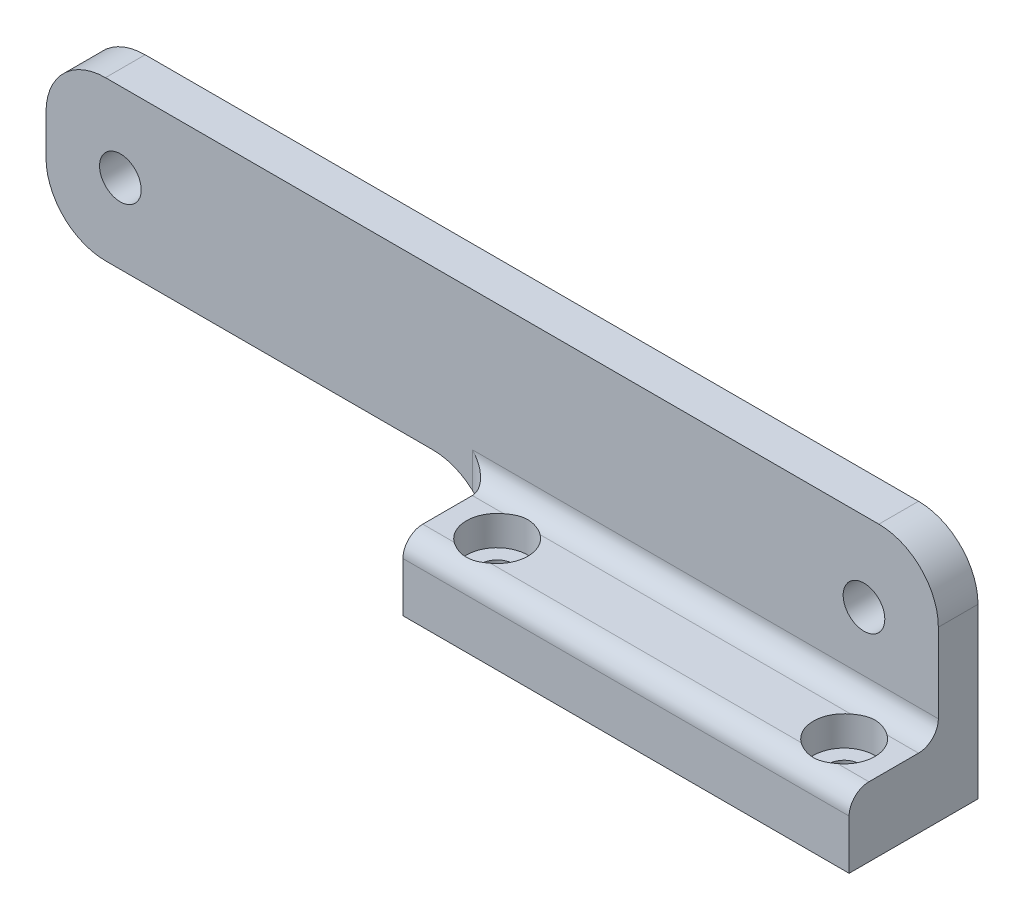
ISO-10303-21;
HEADER;
FILE_DESCRIPTION(('STEP AP214'),'2;1');
FILE_NAME('part.step','',(''),(''),'','','');
FILE_SCHEMA(('AUTOMOTIVE_DESIGN { 1 0 10303 214 1 1 1 1 }'));
ENDSEC;
DATA;
#1=APPLICATION_CONTEXT('core data for automotive mechanical design processes');
#2=APPLICATION_PROTOCOL_DEFINITION('international standard','automotive_design',2000,#1);
#3=PRODUCT_CONTEXT('',#1,'mechanical');
#4=PRODUCT('Part','Part','',(#3));
#5=PRODUCT_RELATED_PRODUCT_CATEGORY('part','',(#4));
#6=PRODUCT_DEFINITION_FORMATION('','',#4);
#7=PRODUCT_DEFINITION_CONTEXT('part definition',#1,'design');
#8=PRODUCT_DEFINITION('design','',#6,#7);
#9=PRODUCT_DEFINITION_SHAPE('','',#8);
#10=(LENGTH_UNIT() NAMED_UNIT(*) SI_UNIT(.MILLI.,.METRE.));
#11=(NAMED_UNIT(*) PLANE_ANGLE_UNIT() SI_UNIT($,.RADIAN.));
#12=(NAMED_UNIT(*) SI_UNIT($,.STERADIAN.) SOLID_ANGLE_UNIT());
#13=UNCERTAINTY_MEASURE_WITH_UNIT(LENGTH_MEASURE(1.E-05),#10,'distance_accuracy_value','');
#14=(GEOMETRIC_REPRESENTATION_CONTEXT(3) GLOBAL_UNCERTAINTY_ASSIGNED_CONTEXT((#13)) GLOBAL_UNIT_ASSIGNED_CONTEXT((#10,
#11,#12)) REPRESENTATION_CONTEXT('',''));
#15=CARTESIAN_POINT('',(0.,0.,0.));
#16=DIRECTION('',(0.,0.,1.));
#17=DIRECTION('',(1.,0.,0.));
#18=AXIS2_PLACEMENT_3D('',#15,#16,#17);
#19=CARTESIAN_POINT('',(0.,-8.,0.));
#20=DIRECTION('',(0.,1.,0.));
#21=DIRECTION('',(-1.,0.,0.));
#22=AXIS2_PLACEMENT_3D('',#19,#20,#21);
#23=PLANE('',#22);
#24=DIRECTION('',(0.,0.,-1.));
#25=VECTOR('',#24,1.);
#26=CARTESIAN_POINT('',(0.,-8.,0.));
#27=LINE('',#26,#25);
#28=CARTESIAN_POINT('',(0.,-8.,11.));
#29=VERTEX_POINT('',#28);
#30=CARTESIAN_POINT('',(0.,-8.,6.));
#31=VERTEX_POINT('',#30);
#32=EDGE_CURVE('E339',#29,#31,#27,.T.);
#33=ORIENTED_EDGE('',*,*,#32,.F.);
#34=DIRECTION('',(-1.,0.,0.));
#35=VECTOR('',#34,1.);
#36=CARTESIAN_POINT('',(45.,-7.99999999999999,11.));
#37=LINE('',#36,#35);
#38=CARTESIAN_POINT('',(3.16696972201766,-8.,11.));
#39=VERTEX_POINT('',#38);
#40=EDGE_CURVE('E306',#29,#39,#37,.F.);
#41=ORIENTED_EDGE('',*,*,#40,.T.);
#42=CARTESIAN_POINT('',(5.,-8.,8.5));
#43=DIRECTION('',(0.,1.,0.));
#44=DIRECTION('',(-1.,0.,0.));
#45=AXIS2_PLACEMENT_3D('',#42,#43,#44);
#46=CIRCLE('',#45,3.1);
#47=CARTESIAN_POINT('',(3.16696972201766,-8.,6.));
#48=VERTEX_POINT('',#47);
#49=EDGE_CURVE('E355',#39,#48,#46,.F.);
#50=ORIENTED_EDGE('',*,*,#49,.T.);
#51=DIRECTION('',(1.,0.,0.));
#52=VECTOR('',#51,1.);
#53=CARTESIAN_POINT('',(0.,-8.,6.));
#54=LINE('',#53,#52);
#55=EDGE_CURVE('E189',#48,#31,#54,.F.);
#56=ORIENTED_EDGE('',*,*,#55,.T.);
#57=EDGE_LOOP('',(#33,#41,#50,#56));
#58=FACE_BOUND('',#57,.T.);
#59=ADVANCED_FACE('F39',(#58),#23,.T.);
#60=CARTESIAN_POINT('',(6.83303027798234,-8.,6.));
#61=VERTEX_POINT('',#60);
#62=CARTESIAN_POINT('',(6.83303027798234,-8.,11.));
#63=VERTEX_POINT('',#62);
#64=EDGE_CURVE('E325',#61,#63,#46,.F.);
#65=ORIENTED_EDGE('',*,*,#64,.T.);
#66=DIRECTION('',(-1.,0.,0.));
#67=VECTOR('',#66,1.);
#68=CARTESIAN_POINT('',(45.,-7.99999999999999,11.));
#69=LINE('',#68,#67);
#70=CARTESIAN_POINT('',(38.1669697220176,-7.99999999999999,11.));
#71=VERTEX_POINT('',#70);
#72=EDGE_CURVE('E54',#63,#71,#69,.F.);
#73=ORIENTED_EDGE('',*,*,#72,.T.);
#74=CARTESIAN_POINT('',(40.,-7.99999999999999,8.5));
#75=DIRECTION('',(0.,1.,0.));
#76=DIRECTION('',(-1.,0.,0.));
#77=AXIS2_PLACEMENT_3D('',#74,#75,#76);
#78=CIRCLE('',#77,3.1);
#79=CARTESIAN_POINT('',(38.1669697220176,-7.99999999999999,6.));
#80=VERTEX_POINT('',#79);
#81=EDGE_CURVE('E164',#71,#80,#78,.F.);
#82=ORIENTED_EDGE('',*,*,#81,.T.);
#83=EDGE_CURVE('E169',#80,#61,#54,.F.);
#84=ORIENTED_EDGE('',*,*,#83,.T.);
#85=EDGE_LOOP('',(#65,#73,#82,#84));
#86=FACE_BOUND('',#85,.T.);
#87=ADVANCED_FACE('F170',(#86),#23,.T.);
#88=CARTESIAN_POINT('',(40.,-15.,8.5));
#89=DIRECTION('',(0.,1.,0.));
#90=DIRECTION('',(-1.,0.,0.));
#91=AXIS2_PLACEMENT_3D('',#88,#89,#90);
#92=CYLINDRICAL_SURFACE('',#91,1.6);
#93=CARTESIAN_POINT('',(40.,-15.,8.5));
#94=DIRECTION('',(0.,-1.,0.));
#95=DIRECTION('',(1.,0.,0.));
#96=AXIS2_PLACEMENT_3D('',#93,#94,#95);
#97=CIRCLE('',#96,1.6);
#98=CARTESIAN_POINT('',(41.6,-15.,8.5));
#99=VERTEX_POINT('',#98);
#100=EDGE_CURVE('E343',#99,#99,#97,.T.);
#101=ORIENTED_EDGE('',*,*,#100,.T.);
#102=EDGE_LOOP('',(#101));
#103=FACE_BOUND('',#102,.T.);
#104=CARTESIAN_POINT('',(40.,-11.,8.5));
#105=DIRECTION('',(0.,1.,0.));
#106=DIRECTION('',(-1.,0.,0.));
#107=AXIS2_PLACEMENT_3D('',#104,#105,#106);
#108=CIRCLE('',#107,1.6);
#109=CARTESIAN_POINT('',(38.4,-11.,8.5));
#110=VERTEX_POINT('',#109);
#111=EDGE_CURVE('E317',#110,#110,#108,.T.);
#112=ORIENTED_EDGE('',*,*,#111,.T.);
#113=EDGE_LOOP('',(#112));
#114=FACE_BOUND('',#113,.T.);
#115=ADVANCED_FACE('F272',(#103,#114),#92,.F.);
#116=CARTESIAN_POINT('',(5.,-15.,8.5));
#117=DIRECTION('',(0.,1.,0.));
#118=DIRECTION('',(-1.,0.,0.));
#119=AXIS2_PLACEMENT_3D('',#116,#117,#118);
#120=CYLINDRICAL_SURFACE('',#119,1.6);
#121=CARTESIAN_POINT('',(5.,-15.,8.5));
#122=DIRECTION('',(0.,-1.,0.));
#123=DIRECTION('',(1.,0.,0.));
#124=AXIS2_PLACEMENT_3D('',#121,#122,#123);
#125=CIRCLE('',#124,1.6);
#126=CARTESIAN_POINT('',(6.6,-15.,8.5));
#127=VERTEX_POINT('',#126);
#128=EDGE_CURVE('E358',#127,#127,#125,.T.);
#129=ORIENTED_EDGE('',*,*,#128,.T.);
#130=EDGE_LOOP('',(#129));
#131=FACE_BOUND('',#130,.T.);
#132=CARTESIAN_POINT('',(5.,-11.,8.5));
#133=DIRECTION('',(0.,1.,0.));
#134=DIRECTION('',(-1.,0.,0.));
#135=AXIS2_PLACEMENT_3D('',#132,#133,#134);
#136=CIRCLE('',#135,1.6);
#137=CARTESIAN_POINT('',(3.4,-11.,8.5));
#138=VERTEX_POINT('',#137);
#139=EDGE_CURVE('E318',#138,#138,#136,.T.);
#140=ORIENTED_EDGE('',*,*,#139,.T.);
#141=EDGE_LOOP('',(#140));
#142=FACE_BOUND('',#141,.T.);
#143=ADVANCED_FACE('F274',(#131,#142),#120,.F.);
#144=CARTESIAN_POINT('',(0.,-6.,6.));
#145=DIRECTION('',(-1.,0.,0.));
#146=DIRECTION('',(0.,-1.,0.));
#147=AXIS2_PLACEMENT_3D('',#144,#145,#146);
#148=CYLINDRICAL_SURFACE('',#147,2.);
#149=CARTESIAN_POINT('',(6.83303027798234,-8.,6.));
#150=CARTESIAN_POINT('',(6.76449494612207,-7.99998264689894,5.94973783714914));
#151=CARTESIAN_POINT('',(6.69391819545035,-7.99810559046724,5.90233466868285));
#152=CARTESIAN_POINT('',(6.54923815681371,-7.99179104050374,5.81354412750177));
#153=CARTESIAN_POINT('',(6.47513704790273,-7.98735511067528,5.77215310014403));
#154=CARTESIAN_POINT('',(6.32377948110168,-7.97707213087283,5.69557193453422));
#155=CARTESIAN_POINT('',(6.24651897329912,-7.97122321934554,5.66039008335478));
#156=CARTESIAN_POINT('',(6.08938927079875,-7.95914050903512,5.59648074563455));
#157=CARTESIAN_POINT('',(6.00951969654554,-7.95290665413363,5.56775420301586));
#158=CARTESIAN_POINT('',(5.84766372273462,-7.94096174482682,5.51693771141607));
#159=CARTESIAN_POINT('',(5.76567749142091,-7.93525064903262,5.49484723671529));
#160=CARTESIAN_POINT('',(5.6000949434055,-7.92510249311901,5.45745355975275));
#161=CARTESIAN_POINT('',(5.51649871384253,-7.92066536425368,5.44214999123112));
#162=CARTESIAN_POINT('',(5.34838561995346,-7.91362927498997,5.41847095964527));
#163=CARTESIAN_POINT('',(5.26387041650136,-7.91102742508647,5.41008460242406));
#164=CARTESIAN_POINT('',(5.09439738564235,-7.90797198688448,5.4002753287223));
#165=CARTESIAN_POINT('',(5.00943956362914,-7.90751837246879,5.39885232758466));
#166=CARTESIAN_POINT('',(4.83974711912419,-7.90881487784743,5.4029821902375));
#167=CARTESIAN_POINT('',(4.75501241781024,-7.91056407121034,5.40853212143048));
#168=CARTESIAN_POINT('',(4.58634638006104,-7.91604934610271,5.42655167744357));
#169=CARTESIAN_POINT('',(4.50241507529584,-7.91978550563307,5.43902157391663));
#170=CARTESIAN_POINT('',(4.33583153008964,-7.92878578880485,5.47079541860781));
#171=CARTESIAN_POINT('',(4.2531810811324,-7.93405187915086,5.49010817028134));
#172=CARTESIAN_POINT('',(4.08979574069271,-7.94543405215809,5.53542330214061));
#173=CARTESIAN_POINT('',(4.00906082241488,-7.95155012292115,5.56142558868958));
#174=CARTESIAN_POINT('',(3.86163563039148,-7.96289075549716,5.6156696618299));
#175=CARTESIAN_POINT('',(3.79461836727429,-7.96811486512544,5.64302755573383));
#176=CARTESIAN_POINT('',(3.66263787461189,-7.97795967535814,5.70237659833457));
#177=CARTESIAN_POINT('',(3.59767414784063,-7.98258052289279,5.73436661481533));
#178=CARTESIAN_POINT('',(3.47020340282238,-7.99055123772206,5.80278998880216));
#179=CARTESIAN_POINT('',(3.40769190568026,-7.99390352911447,5.8392146940684));
#180=CARTESIAN_POINT('',(3.28528013028147,-7.99862403297075,5.91640106584744));
#181=CARTESIAN_POINT('',(3.22538143230827,-7.99999106040637,5.9571653071151));
#182=CARTESIAN_POINT('',(3.16696972201766,-8.,6.));
#183=B_SPLINE_CURVE_WITH_KNOTS('',3,(#149,#150,#151,#152,#153,#154,#155,#156,#157,#158,#159,
#160,#161,#162,#163,#164,#165,#166,#167,#168,#169,#170,#171,#172,#173,#174,#175,#176,#177,#178,
#179,#180,#181,#182),.UNSPECIFIED.,.F.,.F.,(4,2,2,2,2,2,2,2,2,2,2,2,2,2,2,2,4),(0.,
0.254817439620145,0.509479327423223,0.764478570696377,1.01951507679293,1.2745313731673,
1.52953390574457,1.78413405493536,2.03873110881429,2.29322112295979,2.54772112817427,
2.80254974819496,3.05737480144623,3.27492648131137,3.49242507514365,3.70950592415545,
3.92671629818781),.UNSPECIFIED.);
#184=EDGE_CURVE('E179',#61,#48,#183,.T.);
#185=ORIENTED_EDGE('',*,*,#184,.F.);
#186=ORIENTED_EDGE('',*,*,#83,.F.);
#187=CARTESIAN_POINT('',(41.8330302779823,-7.99999999999999,6.));
#188=CARTESIAN_POINT('',(41.764494946122,-7.99998264689894,5.94973783714914));
#189=CARTESIAN_POINT('',(41.6939181954503,-7.99810559046724,5.90233466868285));
#190=CARTESIAN_POINT('',(41.5492381568137,-7.99179104050374,5.81354412750177));
#191=CARTESIAN_POINT('',(41.4751370479027,-7.98735511067528,5.77215310014403));
#192=CARTESIAN_POINT('',(41.3237794811017,-7.97707213087283,5.69557193453422));
#193=CARTESIAN_POINT('',(41.2465189732991,-7.97122321934554,5.66039008335478));
#194=CARTESIAN_POINT('',(41.0893892707987,-7.95914050903511,5.59648074563455));
#195=CARTESIAN_POINT('',(41.0095196965455,-7.95290665413363,5.56775420301585));
#196=CARTESIAN_POINT('',(40.8476637227346,-7.94096174482681,5.51693771141606));
#197=CARTESIAN_POINT('',(40.7656774914209,-7.93525064903262,5.49484723671529));
#198=CARTESIAN_POINT('',(40.6000949434055,-7.925102493119,5.45745355975274));
#199=CARTESIAN_POINT('',(40.5164987138425,-7.92066536425367,5.44214999123112));
#200=CARTESIAN_POINT('',(40.3483856199534,-7.91362927498996,5.41847095964527));
#201=CARTESIAN_POINT('',(40.2638704165013,-7.91102742508646,5.41008460242406));
#202=CARTESIAN_POINT('',(40.0943973856423,-7.90797198688447,5.40027532872229));
#203=CARTESIAN_POINT('',(40.0094395636291,-7.90751837246879,5.39885232758466));
#204=CARTESIAN_POINT('',(39.8397471191242,-7.90881487784743,5.4029821902375));
#205=CARTESIAN_POINT('',(39.7550124178102,-7.91056407121033,5.40853212143047));
#206=CARTESIAN_POINT('',(39.586346380061,-7.9160493461027,5.42655167744357));
#207=CARTESIAN_POINT('',(39.5024150752958,-7.91978550563306,5.43902157391663));
#208=CARTESIAN_POINT('',(39.3358315300896,-7.92878578880484,5.4707954186078));
#209=CARTESIAN_POINT('',(39.2531810811324,-7.93405187915086,5.49010817028134));
#210=CARTESIAN_POINT('',(39.0897957406927,-7.94543405215808,5.5354233021406));
#211=CARTESIAN_POINT('',(39.0090608224149,-7.95155012292114,5.56142558868958));
#212=CARTESIAN_POINT('',(38.8616356303915,-7.96289075549715,5.6156696618299));
#213=CARTESIAN_POINT('',(38.7946183672743,-7.96811486512544,5.64302755573382));
#214=CARTESIAN_POINT('',(38.6626378746119,-7.97795967535813,5.70237659833457));
#215=CARTESIAN_POINT('',(38.5976741478406,-7.98258052289278,5.73436661481533));
#216=CARTESIAN_POINT('',(38.4702034028224,-7.99055123772206,5.80278998880216));
#217=CARTESIAN_POINT('',(38.4076919056802,-7.99390352911447,5.8392146940684));
#218=CARTESIAN_POINT('',(38.2852801302814,-7.99862403297075,5.91640106584744));
#219=CARTESIAN_POINT('',(38.2253814323082,-7.99999106040636,5.9571653071151));
#220=CARTESIAN_POINT('',(38.1669697220176,-8.,6.));
#221=B_SPLINE_CURVE_WITH_KNOTS('',3,(#187,#188,#189,#190,#191,#192,#193,#194,#195,#196,#197,
#198,#199,#200,#201,#202,#203,#204,#205,#206,#207,#208,#209,#210,#211,#212,#213,#214,#215,#216,
#217,#218,#219,#220),.UNSPECIFIED.,.F.,.F.,(4,2,2,2,2,2,2,2,2,2,2,2,2,2,2,2,4),(0.,
0.254817439620144,0.509479327423224,0.764478570696375,1.01951507679294,1.2745313731673,
1.52953390574457,1.78413405493536,2.03873110881429,2.29322112295979,2.54772112817428,
2.80254974819497,3.05737480144623,3.27492648131138,3.49242507514366,3.70950592415547,
3.92671629818782),.UNSPECIFIED.);
#222=CARTESIAN_POINT('',(41.8330302779823,-7.99999999999999,6.));
#223=VERTEX_POINT('',#222);
#224=EDGE_CURVE('E172',#223,#80,#221,.T.);
#225=ORIENTED_EDGE('',*,*,#224,.F.);
#226=CARTESIAN_POINT('',(45.,-7.99999999999999,6.));
#227=VERTEX_POINT('',#226);
#228=EDGE_CURVE('E190',#227,#223,#54,.F.);
#229=ORIENTED_EDGE('',*,*,#228,.F.);
#230=CARTESIAN_POINT('',(45.,-5.99999999999999,6.));
#231=DIRECTION('',(-1.,0.,0.));
#232=DIRECTION('',(0.,0.,1.));
#233=AXIS2_PLACEMENT_3D('',#230,#231,#232);
#234=CIRCLE('',#233,2.);
#235=CARTESIAN_POINT('',(45.,-5.99999999999999,4.));
#236=VERTEX_POINT('',#235);
#237=EDGE_CURVE('E181',#236,#227,#234,.T.);
#238=ORIENTED_EDGE('',*,*,#237,.F.);
#239=DIRECTION('',(1.,0.,0.));
#240=VECTOR('',#239,1.);
#241=CARTESIAN_POINT('',(45.,-5.99999999999999,4.));
#242=LINE('',#241,#240);
#243=CARTESIAN_POINT('',(-2.,-6.,4.));
#244=VERTEX_POINT('',#243);
#245=EDGE_CURVE('E457',#244,#236,#242,.T.);
#246=ORIENTED_EDGE('',*,*,#245,.F.);
#247=CARTESIAN_POINT('',(-2.,-6.,6.));
#248=DIRECTION('',(-0.707106781186547,-0.707106781186548,0.));
#249=DIRECTION('',(-0.707106781186548,0.707106781186547,0.));
#250=AXIS2_PLACEMENT_3D('',#247,#248,#249);
#251=ELLIPSE('',#250,2.82842712474619,2.);
#252=EDGE_CURVE('E316',#31,#244,#251,.F.);
#253=ORIENTED_EDGE('',*,*,#252,.F.);
#254=ORIENTED_EDGE('',*,*,#55,.F.);
#255=EDGE_LOOP('',(#185,#186,#225,#229,#238,#246,#253,#254));
#256=FACE_BOUND('',#255,.T.);
#257=ADVANCED_FACE('F183',(#256),#148,.F.);
#258=CARTESIAN_POINT('',(45.,-7.99999999999999,4.));
#259=DIRECTION('',(0.,1.,0.));
#260=DIRECTION('',(-1.,0.,0.));
#261=AXIS2_PLACEMENT_3D('',#258,#259,#260);
#262=PLANE('',#261);
#263=DIRECTION('',(1.,0.,0.));
#264=VECTOR('',#263,1.);
#265=CARTESIAN_POINT('',(45.,-7.99999999999999,4.));
#266=LINE('',#265,#264);
#267=CARTESIAN_POINT('',(-39.,-8.00000000000001,4.));
#268=VERTEX_POINT('',#267);
#269=CARTESIAN_POINT('',(-5.99999999999998,-8.,4.));
#270=VERTEX_POINT('',#269);
#271=EDGE_CURVE('E399',#268,#270,#266,.T.);
#272=ORIENTED_EDGE('',*,*,#271,.F.);
#273=DIRECTION('',(0.,0.,-1.));
#274=VECTOR('',#273,1.);
#275=CARTESIAN_POINT('',(-39.,-8.00000000000001,4.));
#276=LINE('',#275,#274);
#277=CARTESIAN_POINT('',(-39.,-8.00000000000001,0.));
#278=VERTEX_POINT('',#277);
#279=EDGE_CURVE('E443',#268,#278,#276,.T.);
#280=ORIENTED_EDGE('',*,*,#279,.T.);
#281=DIRECTION('',(1.,0.,0.));
#282=VECTOR('',#281,1.);
#283=CARTESIAN_POINT('',(45.,-7.99999999999999,0.));
#284=LINE('',#283,#282);
#285=CARTESIAN_POINT('',(-5.99999999999998,-8.,0.));
#286=VERTEX_POINT('',#285);
#287=EDGE_CURVE('E408',#278,#286,#284,.T.);
#288=ORIENTED_EDGE('',*,*,#287,.T.);
#289=DIRECTION('',(0.,0.,-1.));
#290=VECTOR('',#289,1.);
#291=CARTESIAN_POINT('',(-6.,-8.,4.));
#292=LINE('',#291,#290);
#293=EDGE_CURVE('E445',#286,#270,#292,.F.);
#294=ORIENTED_EDGE('',*,*,#293,.T.);
#295=EDGE_LOOP('',(#272,#280,#288,#294));
#296=FACE_BOUND('',#295,.T.);
#297=ADVANCED_FACE('F229',(#296),#262,.F.);
#298=CARTESIAN_POINT('',(0.,0.,4.));
#299=DIRECTION('',(0.,0.,1.));
#300=DIRECTION('',(1.,0.,0.));
#301=AXIS2_PLACEMENT_3D('',#298,#299,#300);
#302=PLANE('',#301);
#303=CARTESIAN_POINT('',(-37.5,0.,4.));
#304=DIRECTION('',(0.,0.,1.));
#305=DIRECTION('',(1.,0.,0.));
#306=AXIS2_PLACEMENT_3D('',#303,#304,#305);
#307=CIRCLE('',#306,2.1);
#308=CARTESIAN_POINT('',(-35.4,0.,4.));
#309=VERTEX_POINT('',#308);
#310=EDGE_CURVE('E386',#309,#309,#307,.T.);
#311=ORIENTED_EDGE('',*,*,#310,.F.);
#312=EDGE_LOOP('',(#311));
#313=FACE_BOUND('',#312,.T.);
#314=CARTESIAN_POINT('',(-6.,-14.,4.));
#315=DIRECTION('',(0.,0.,1.));
#316=DIRECTION('',(1.,0.,0.));
#317=AXIS2_PLACEMENT_3D('',#314,#315,#316);
#318=CIRCLE('',#317,6.);
#319=CARTESIAN_POINT('',(-2.,-9.52786404500042,4.));
#320=VERTEX_POINT('',#319);
#321=EDGE_CURVE('E455',#270,#320,#318,.F.);
#322=ORIENTED_EDGE('',*,*,#321,.T.);
#323=DIRECTION('',(0.,-1.,0.));
#324=VECTOR('',#323,1.);
#325=CARTESIAN_POINT('',(-2.,0.,4.));
#326=LINE('',#325,#324);
#327=EDGE_CURVE('E195',#320,#244,#326,.F.);
#328=ORIENTED_EDGE('',*,*,#327,.T.);
#329=ORIENTED_EDGE('',*,*,#245,.T.);
#330=DIRECTION('',(0.,1.,0.));
#331=VECTOR('',#330,1.);
#332=CARTESIAN_POINT('',(45.,-7.99999999999999,4.));
#333=LINE('',#332,#331);
#334=CARTESIAN_POINT('',(45.,2.,4.));
#335=VERTEX_POINT('',#334);
#336=EDGE_CURVE('E405',#236,#335,#333,.T.);
#337=ORIENTED_EDGE('',*,*,#336,.T.);
#338=CARTESIAN_POINT('',(39.,2.,4.));
#339=DIRECTION('',(0.,0.,1.));
#340=DIRECTION('',(1.,0.,0.));
#341=AXIS2_PLACEMENT_3D('',#338,#339,#340);
#342=CIRCLE('',#341,6.);
#343=CARTESIAN_POINT('',(39.,8.00000000000001,4.));
#344=VERTEX_POINT('',#343);
#345=EDGE_CURVE('E434',#335,#344,#342,.T.);
#346=ORIENTED_EDGE('',*,*,#345,.T.);
#347=DIRECTION('',(-1.,0.,0.));
#348=VECTOR('',#347,1.);
#349=CARTESIAN_POINT('',(45.,8.00000000000001,4.));
#350=LINE('',#349,#348);
#351=CARTESIAN_POINT('',(-39.,7.99999999999999,4.));
#352=VERTEX_POINT('',#351);
#353=EDGE_CURVE('E404',#344,#352,#350,.T.);
#354=ORIENTED_EDGE('',*,*,#353,.T.);
#355=CARTESIAN_POINT('',(-39.,1.99999999999999,4.));
#356=DIRECTION('',(0.,0.,1.));
#357=DIRECTION('',(1.,0.,0.));
#358=AXIS2_PLACEMENT_3D('',#355,#356,#357);
#359=CIRCLE('',#358,6.);
#360=CARTESIAN_POINT('',(-45.,1.99999999999999,4.));
#361=VERTEX_POINT('',#360);
#362=EDGE_CURVE('E433',#352,#361,#359,.T.);
#363=ORIENTED_EDGE('',*,*,#362,.T.);
#364=DIRECTION('',(0.,-1.,0.));
#365=VECTOR('',#364,1.);
#366=CARTESIAN_POINT('',(-45.,-8.00000000000001,4.));
#367=LINE('',#366,#365);
#368=CARTESIAN_POINT('',(-45.,-2.,4.));
#369=VERTEX_POINT('',#368);
#370=EDGE_CURVE('E393',#361,#369,#367,.T.);
#371=ORIENTED_EDGE('',*,*,#370,.T.);
#372=CARTESIAN_POINT('',(-39.,-2.,4.));
#373=DIRECTION('',(0.,0.,1.));
#374=DIRECTION('',(1.,0.,0.));
#375=AXIS2_PLACEMENT_3D('',#372,#373,#374);
#376=CIRCLE('',#375,6.);
#377=EDGE_CURVE('E431',#369,#268,#376,.T.);
#378=ORIENTED_EDGE('',*,*,#377,.T.);
#379=ORIENTED_EDGE('',*,*,#271,.T.);
#380=EDGE_LOOP('',(#322,#328,#329,#337,#346,#354,#363,#371,#378,#379));
#381=FACE_BOUND('',#380,.T.);
#382=CARTESIAN_POINT('',(37.5,0.,4.));
#383=DIRECTION('',(0.,0.,1.));
#384=DIRECTION('',(1.,0.,0.));
#385=AXIS2_PLACEMENT_3D('',#382,#383,#384);
#386=CIRCLE('',#385,2.1);
#387=CARTESIAN_POINT('',(39.6,0.,4.));
#388=VERTEX_POINT('',#387);
#389=EDGE_CURVE('E384',#388,#388,#386,.T.);
#390=ORIENTED_EDGE('',*,*,#389,.F.);
#391=EDGE_LOOP('',(#390));
#392=FACE_BOUND('',#391,.T.);
#393=ADVANCED_FACE('F231',(#313,#381,#392),#302,.T.);
#394=CARTESIAN_POINT('',(0.,0.,0.));
#395=DIRECTION('',(0.,0.,1.));
#396=DIRECTION('',(1.,0.,0.));
#397=AXIS2_PLACEMENT_3D('',#394,#395,#396);
#398=PLANE('',#397);
#399=DIRECTION('',(-1.,0.,0.));
#400=VECTOR('',#399,1.);
#401=CARTESIAN_POINT('',(45.,8.00000000000001,0.));
#402=LINE('',#401,#400);
#403=CARTESIAN_POINT('',(39.,8.00000000000001,0.));
#404=VERTEX_POINT('',#403);
#405=CARTESIAN_POINT('',(-39.,7.99999999999999,0.));
#406=VERTEX_POINT('',#405);
#407=EDGE_CURVE('E396',#404,#406,#402,.T.);
#408=ORIENTED_EDGE('',*,*,#407,.F.);
#409=CARTESIAN_POINT('',(39.,2.,0.));
#410=DIRECTION('',(0.,0.,1.));
#411=DIRECTION('',(1.,0.,0.));
#412=AXIS2_PLACEMENT_3D('',#409,#410,#411);
#413=CIRCLE('',#412,6.);
#414=CARTESIAN_POINT('',(45.,2.,0.));
#415=VERTEX_POINT('',#414);
#416=EDGE_CURVE('E428',#404,#415,#413,.F.);
#417=ORIENTED_EDGE('',*,*,#416,.T.);
#418=DIRECTION('',(0.,1.,0.));
#419=VECTOR('',#418,1.);
#420=CARTESIAN_POINT('',(45.,-7.99999999999999,0.));
#421=LINE('',#420,#419);
#422=CARTESIAN_POINT('',(45.,-15.,0.));
#423=VERTEX_POINT('',#422);
#424=EDGE_CURVE('E414',#423,#415,#421,.T.);
#425=ORIENTED_EDGE('',*,*,#424,.F.);
#426=DIRECTION('',(1.,0.,0.));
#427=VECTOR('',#426,1.);
#428=CARTESIAN_POINT('',(0.,-15.,0.));
#429=LINE('',#428,#427);
#430=CARTESIAN_POINT('',(0.,-15.,0.));
#431=VERTEX_POINT('',#430);
#432=EDGE_CURVE('E364',#431,#423,#429,.T.);
#433=ORIENTED_EDGE('',*,*,#432,.F.);
#434=DIRECTION('',(0.,1.,0.));
#435=VECTOR('',#434,1.);
#436=CARTESIAN_POINT('',(0.,-15.,0.));
#437=LINE('',#436,#435);
#438=CARTESIAN_POINT('',(0.,-14.,0.));
#439=VERTEX_POINT('',#438);
#440=EDGE_CURVE('E378',#431,#439,#437,.T.);
#441=ORIENTED_EDGE('',*,*,#440,.T.);
#442=CARTESIAN_POINT('',(-6.,-14.,0.));
#443=DIRECTION('',(0.,0.,1.));
#444=DIRECTION('',(1.,0.,0.));
#445=AXIS2_PLACEMENT_3D('',#442,#443,#444);
#446=CIRCLE('',#445,6.);
#447=EDGE_CURVE('E448',#439,#286,#446,.T.);
#448=ORIENTED_EDGE('',*,*,#447,.T.);
#449=ORIENTED_EDGE('',*,*,#287,.F.);
#450=CARTESIAN_POINT('',(-39.,-2.,0.));
#451=DIRECTION('',(0.,0.,1.));
#452=DIRECTION('',(1.,0.,0.));
#453=AXIS2_PLACEMENT_3D('',#450,#451,#452);
#454=CIRCLE('',#453,6.);
#455=CARTESIAN_POINT('',(-45.,-2.,0.));
#456=VERTEX_POINT('',#455);
#457=EDGE_CURVE('E422',#278,#456,#454,.F.);
#458=ORIENTED_EDGE('',*,*,#457,.T.);
#459=DIRECTION('',(0.,-1.,0.));
#460=VECTOR('',#459,1.);
#461=CARTESIAN_POINT('',(-45.,-8.00000000000001,0.));
#462=LINE('',#461,#460);
#463=CARTESIAN_POINT('',(-45.,1.99999999999999,0.));
#464=VERTEX_POINT('',#463);
#465=EDGE_CURVE('E395',#464,#456,#462,.T.);
#466=ORIENTED_EDGE('',*,*,#465,.F.);
#467=CARTESIAN_POINT('',(-39.,1.99999999999999,0.));
#468=DIRECTION('',(0.,0.,1.));
#469=DIRECTION('',(1.,0.,0.));
#470=AXIS2_PLACEMENT_3D('',#467,#468,#469);
#471=CIRCLE('',#470,6.);
#472=EDGE_CURVE('E425',#464,#406,#471,.F.);
#473=ORIENTED_EDGE('',*,*,#472,.T.);
#474=EDGE_LOOP('',(#408,#417,#425,#433,#441,#448,#449,#458,#466,#473));
#475=FACE_BOUND('',#474,.T.);
#476=CARTESIAN_POINT('',(-37.5,0.,0.));
#477=DIRECTION('',(0.,0.,1.));
#478=DIRECTION('',(1.,0.,0.));
#479=AXIS2_PLACEMENT_3D('',#476,#477,#478);
#480=CIRCLE('',#479,2.1);
#481=CARTESIAN_POINT('',(-35.4,0.,0.));
#482=VERTEX_POINT('',#481);
#483=EDGE_CURVE('E387',#482,#482,#480,.T.);
#484=ORIENTED_EDGE('',*,*,#483,.T.);
#485=EDGE_LOOP('',(#484));
#486=FACE_BOUND('',#485,.T.);
#487=CARTESIAN_POINT('',(37.5,0.,0.));
#488=DIRECTION('',(0.,0.,1.));
#489=DIRECTION('',(1.,0.,0.));
#490=AXIS2_PLACEMENT_3D('',#487,#488,#489);
#491=CIRCLE('',#490,2.1);
#492=CARTESIAN_POINT('',(39.6,0.,0.));
#493=VERTEX_POINT('',#492);
#494=EDGE_CURVE('E385',#493,#493,#491,.T.);
#495=ORIENTED_EDGE('',*,*,#494,.T.);
#496=EDGE_LOOP('',(#495));
#497=FACE_BOUND('',#496,.T.);
#498=ADVANCED_FACE('F226',(#475,#486,#497),#398,.F.);
#499=CARTESIAN_POINT('',(-45.,-8.00000000000001,4.));
#500=DIRECTION('',(1.,0.,0.));
#501=DIRECTION('',(0.,0.,-1.));
#502=AXIS2_PLACEMENT_3D('',#499,#500,#501);
#503=PLANE('',#502);
#504=ORIENTED_EDGE('',*,*,#370,.F.);
#505=DIRECTION('',(0.,0.,-1.));
#506=VECTOR('',#505,1.);
#507=CARTESIAN_POINT('',(-45.,1.99999999999999,4.));
#508=LINE('',#507,#506);
#509=EDGE_CURVE('E437',#361,#464,#508,.T.);
#510=ORIENTED_EDGE('',*,*,#509,.T.);
#511=ORIENTED_EDGE('',*,*,#465,.T.);
#512=DIRECTION('',(0.,0.,-1.));
#513=VECTOR('',#512,1.);
#514=CARTESIAN_POINT('',(-45.,-2.,4.));
#515=LINE('',#514,#513);
#516=EDGE_CURVE('E440',#456,#369,#515,.F.);
#517=ORIENTED_EDGE('',*,*,#516,.T.);
#518=EDGE_LOOP('',(#504,#510,#511,#517));
#519=FACE_BOUND('',#518,.T.);
#520=ADVANCED_FACE('F221',(#519),#503,.F.);
#521=CARTESIAN_POINT('',(45.,-7.99999999999999,4.));
#522=DIRECTION('',(-1.,0.,0.));
#523=DIRECTION('',(0.,0.,1.));
#524=AXIS2_PLACEMENT_3D('',#521,#522,#523);
#525=PLANE('',#524);
#526=DIRECTION('',(0.,0.,1.));
#527=VECTOR('',#526,1.);
#528=CARTESIAN_POINT('',(45.,-7.99999999999999,0.));
#529=LINE('',#528,#527);
#530=CARTESIAN_POINT('',(45.,-7.99999999999999,11.));
#531=VERTEX_POINT('',#530);
#532=EDGE_CURVE('E341',#227,#531,#529,.T.);
#533=ORIENTED_EDGE('',*,*,#532,.T.);
#534=CARTESIAN_POINT('',(45.,-9.99999999999999,11.));
#535=DIRECTION('',(-1.,0.,0.));
#536=DIRECTION('',(0.,0.,1.));
#537=AXIS2_PLACEMENT_3D('',#534,#535,#536);
#538=CIRCLE('',#537,2.);
#539=CARTESIAN_POINT('',(45.,-9.99999999999999,13.));
#540=VERTEX_POINT('',#539);
#541=EDGE_CURVE('E11',#531,#540,#538,.F.);
#542=ORIENTED_EDGE('',*,*,#541,.T.);
#543=DIRECTION('',(0.,1.,0.));
#544=VECTOR('',#543,1.);
#545=CARTESIAN_POINT('',(45.,-15.,13.));
#546=LINE('',#545,#544);
#547=CARTESIAN_POINT('',(45.,-15.,13.));
#548=VERTEX_POINT('',#547);
#549=EDGE_CURVE('E376',#548,#540,#546,.T.);
#550=ORIENTED_EDGE('',*,*,#549,.F.);
#551=DIRECTION('',(0.,0.,1.));
#552=VECTOR('',#551,1.);
#553=CARTESIAN_POINT('',(45.,-15.,0.));
#554=LINE('',#553,#552);
#555=EDGE_CURVE('E370',#423,#548,#554,.T.);
#556=ORIENTED_EDGE('',*,*,#555,.F.);
#557=ORIENTED_EDGE('',*,*,#424,.T.);
#558=DIRECTION('',(0.,0.,-1.));
#559=VECTOR('',#558,1.);
#560=CARTESIAN_POINT('',(45.,2.,4.));
#561=LINE('',#560,#559);
#562=EDGE_CURVE('E426',#415,#335,#561,.F.);
#563=ORIENTED_EDGE('',*,*,#562,.T.);
#564=ORIENTED_EDGE('',*,*,#336,.F.);
#565=ORIENTED_EDGE('',*,*,#237,.T.);
#566=EDGE_LOOP('',(#533,#542,#550,#556,#557,#563,#564,#565));
#567=FACE_BOUND('',#566,.T.);
#568=ADVANCED_FACE('F227',(#567),#525,.F.);
#569=CARTESIAN_POINT('',(45.,8.00000000000001,4.));
#570=DIRECTION('',(0.,-1.,0.));
#571=DIRECTION('',(1.,0.,0.));
#572=AXIS2_PLACEMENT_3D('',#569,#570,#571);
#573=PLANE('',#572);
#574=ORIENTED_EDGE('',*,*,#353,.F.);
#575=DIRECTION('',(0.,0.,-1.));
#576=VECTOR('',#575,1.);
#577=CARTESIAN_POINT('',(39.,8.00000000000001,4.));
#578=LINE('',#577,#576);
#579=EDGE_CURVE('E416',#344,#404,#578,.T.);
#580=ORIENTED_EDGE('',*,*,#579,.T.);
#581=ORIENTED_EDGE('',*,*,#407,.T.);
#582=DIRECTION('',(0.,0.,-1.));
#583=VECTOR('',#582,1.);
#584=CARTESIAN_POINT('',(-39.,7.99999999999999,4.));
#585=LINE('',#584,#583);
#586=EDGE_CURVE('E410',#406,#352,#585,.F.);
#587=ORIENTED_EDGE('',*,*,#586,.T.);
#588=EDGE_LOOP('',(#574,#580,#581,#587));
#589=FACE_BOUND('',#588,.T.);
#590=ADVANCED_FACE('F240',(#589),#573,.F.);
#591=CARTESIAN_POINT('',(-37.5,0.,4.));
#592=DIRECTION('',(0.,0.,-1.));
#593=DIRECTION('',(-1.,0.,0.));
#594=AXIS2_PLACEMENT_3D('',#591,#592,#593);
#595=CYLINDRICAL_SURFACE('',#594,2.1);
#596=ORIENTED_EDGE('',*,*,#310,.T.);
#597=EDGE_LOOP('',(#596));
#598=FACE_BOUND('',#597,.T.);
#599=ORIENTED_EDGE('',*,*,#483,.F.);
#600=EDGE_LOOP('',(#599));
#601=FACE_BOUND('',#600,.T.);
#602=ADVANCED_FACE('F241',(#598,#601),#595,.F.);
#603=CARTESIAN_POINT('',(37.5,0.,4.));
#604=DIRECTION('',(0.,0.,-1.));
#605=DIRECTION('',(-1.,0.,0.));
#606=AXIS2_PLACEMENT_3D('',#603,#604,#605);
#607=CYLINDRICAL_SURFACE('',#606,2.1);
#608=ORIENTED_EDGE('',*,*,#389,.T.);
#609=EDGE_LOOP('',(#608));
#610=FACE_BOUND('',#609,.T.);
#611=ORIENTED_EDGE('',*,*,#494,.F.);
#612=EDGE_LOOP('',(#611));
#613=FACE_BOUND('',#612,.T.);
#614=ADVANCED_FACE('F252',(#610,#613),#607,.F.);
#615=CARTESIAN_POINT('',(41.8330302779823,-7.99999999999999,11.));
#616=VERTEX_POINT('',#615);
#617=EDGE_CURVE('E167',#223,#616,#78,.F.);
#618=ORIENTED_EDGE('',*,*,#617,.T.);
#619=DIRECTION('',(-1.,0.,0.));
#620=VECTOR('',#619,1.);
#621=CARTESIAN_POINT('',(45.,-7.99999999999999,11.));
#622=LINE('',#621,#620);
#623=EDGE_CURVE('E307',#616,#531,#622,.F.);
#624=ORIENTED_EDGE('',*,*,#623,.T.);
#625=ORIENTED_EDGE('',*,*,#532,.F.);
#626=ORIENTED_EDGE('',*,*,#228,.T.);
#627=EDGE_LOOP('',(#618,#624,#625,#626));
#628=FACE_BOUND('',#627,.T.);
#629=ADVANCED_FACE('F253',(#628),#23,.T.);
#630=CARTESIAN_POINT('',(0.,-15.,0.));
#631=DIRECTION('',(0.,1.,0.));
#632=DIRECTION('',(-1.,0.,0.));
#633=AXIS2_PLACEMENT_3D('',#630,#631,#632);
#634=PLANE('',#633);
#635=DIRECTION('',(0.,0.,-1.));
#636=VECTOR('',#635,1.);
#637=CARTESIAN_POINT('',(0.,-15.,0.));
#638=LINE('',#637,#636);
#639=CARTESIAN_POINT('',(0.,-15.,13.));
#640=VERTEX_POINT('',#639);
#641=EDGE_CURVE('E363',#640,#431,#638,.T.);
#642=ORIENTED_EDGE('',*,*,#641,.T.);
#643=ORIENTED_EDGE('',*,*,#432,.T.);
#644=ORIENTED_EDGE('',*,*,#555,.T.);
#645=DIRECTION('',(-1.,0.,0.));
#646=VECTOR('',#645,1.);
#647=CARTESIAN_POINT('',(0.,-15.,13.));
#648=LINE('',#647,#646);
#649=EDGE_CURVE('E367',#548,#640,#648,.T.);
#650=ORIENTED_EDGE('',*,*,#649,.T.);
#651=EDGE_LOOP('',(#642,#643,#644,#650));
#652=FACE_BOUND('',#651,.T.);
#653=ORIENTED_EDGE('',*,*,#100,.F.);
#654=EDGE_LOOP('',(#653));
#655=FACE_BOUND('',#654,.T.);
#656=ORIENTED_EDGE('',*,*,#128,.F.);
#657=EDGE_LOOP('',(#656));
#658=FACE_BOUND('',#657,.T.);
#659=ADVANCED_FACE('F258',(#652,#655,#658),#634,.F.);
#660=CARTESIAN_POINT('',(0.,-15.,0.));
#661=DIRECTION('',(1.,0.,0.));
#662=DIRECTION('',(0.,1.,0.));
#663=AXIS2_PLACEMENT_3D('',#660,#661,#662);
#664=PLANE('',#663);
#665=DIRECTION('',(0.,1.,0.));
#666=VECTOR('',#665,1.);
#667=CARTESIAN_POINT('',(0.,-15.,13.));
#668=LINE('',#667,#666);
#669=CARTESIAN_POINT('',(0.,-10.,13.));
#670=VERTEX_POINT('',#669);
#671=EDGE_CURVE('E369',#640,#670,#668,.T.);
#672=ORIENTED_EDGE('',*,*,#671,.T.);
#673=CARTESIAN_POINT('',(0.,-10.,11.));
#674=DIRECTION('',(1.,0.,0.));
#675=DIRECTION('',(0.,1.,0.));
#676=AXIS2_PLACEMENT_3D('',#673,#674,#675);
#677=CIRCLE('',#676,2.);
#678=EDGE_CURVE('E311',#670,#29,#677,.F.);
#679=ORIENTED_EDGE('',*,*,#678,.T.);
#680=ORIENTED_EDGE('',*,*,#32,.T.);
#681=DIRECTION('',(0.,-1.,0.));
#682=VECTOR('',#681,1.);
#683=CARTESIAN_POINT('',(0.,-15.,6.));
#684=LINE('',#683,#682);
#685=CARTESIAN_POINT('',(0.,-14.,6.));
#686=VERTEX_POINT('',#685);
#687=EDGE_CURVE('E453',#31,#686,#684,.T.);
#688=ORIENTED_EDGE('',*,*,#687,.T.);
#689=DIRECTION('',(0.,0.,-1.));
#690=VECTOR('',#689,1.);
#691=CARTESIAN_POINT('',(0.,-14.,0.));
#692=LINE('',#691,#690);
#693=EDGE_CURVE('E450',#686,#439,#692,.T.);
#694=ORIENTED_EDGE('',*,*,#693,.T.);
#695=ORIENTED_EDGE('',*,*,#440,.F.);
#696=ORIENTED_EDGE('',*,*,#641,.F.);
#697=EDGE_LOOP('',(#672,#679,#680,#688,#694,#695,#696));
#698=FACE_BOUND('',#697,.T.);
#699=ADVANCED_FACE('F260',(#698),#664,.F.);
#700=CARTESIAN_POINT('',(0.,-15.,13.));
#701=DIRECTION('',(0.,0.,-1.));
#702=DIRECTION('',(-1.,0.,0.));
#703=AXIS2_PLACEMENT_3D('',#700,#701,#702);
#704=PLANE('',#703);
#705=ORIENTED_EDGE('',*,*,#549,.T.);
#706=DIRECTION('',(-1.,0.,0.));
#707=VECTOR('',#706,1.);
#708=CARTESIAN_POINT('',(0.,-10.,13.));
#709=LINE('',#708,#707);
#710=EDGE_CURVE('E312',#540,#670,#709,.T.);
#711=ORIENTED_EDGE('',*,*,#710,.T.);
#712=ORIENTED_EDGE('',*,*,#671,.F.);
#713=ORIENTED_EDGE('',*,*,#649,.F.);
#714=EDGE_LOOP('',(#705,#711,#712,#713));
#715=FACE_BOUND('',#714,.T.);
#716=ADVANCED_FACE('F225',(#715),#704,.F.);
#717=CARTESIAN_POINT('',(39.,2.,4.));
#718=DIRECTION('',(0.,0.,-1.));
#719=DIRECTION('',(-1.,0.,0.));
#720=AXIS2_PLACEMENT_3D('',#717,#718,#719);
#721=CYLINDRICAL_SURFACE('',#720,6.);
#722=ORIENTED_EDGE('',*,*,#345,.F.);
#723=ORIENTED_EDGE('',*,*,#562,.F.);
#724=ORIENTED_EDGE('',*,*,#416,.F.);
#725=ORIENTED_EDGE('',*,*,#579,.F.);
#726=EDGE_LOOP('',(#722,#723,#724,#725));
#727=FACE_BOUND('',#726,.T.);
#728=ADVANCED_FACE('F219',(#727),#721,.T.);
#729=CARTESIAN_POINT('',(-39.,1.99999999999999,4.));
#730=DIRECTION('',(0.,0.,-1.));
#731=DIRECTION('',(-1.,0.,0.));
#732=AXIS2_PLACEMENT_3D('',#729,#730,#731);
#733=CYLINDRICAL_SURFACE('',#732,6.);
#734=ORIENTED_EDGE('',*,*,#362,.F.);
#735=ORIENTED_EDGE('',*,*,#586,.F.);
#736=ORIENTED_EDGE('',*,*,#472,.F.);
#737=ORIENTED_EDGE('',*,*,#509,.F.);
#738=EDGE_LOOP('',(#734,#735,#736,#737));
#739=FACE_BOUND('',#738,.T.);
#740=ADVANCED_FACE('F211',(#739),#733,.T.);
#741=CARTESIAN_POINT('',(-39.,-2.,4.));
#742=DIRECTION('',(0.,0.,-1.));
#743=DIRECTION('',(-1.,0.,0.));
#744=AXIS2_PLACEMENT_3D('',#741,#742,#743);
#745=CYLINDRICAL_SURFACE('',#744,6.);
#746=ORIENTED_EDGE('',*,*,#377,.F.);
#747=ORIENTED_EDGE('',*,*,#516,.F.);
#748=ORIENTED_EDGE('',*,*,#457,.F.);
#749=ORIENTED_EDGE('',*,*,#279,.F.);
#750=EDGE_LOOP('',(#746,#747,#748,#749));
#751=FACE_BOUND('',#750,.T.);
#752=ADVANCED_FACE('F208',(#751),#745,.T.);
#753=CARTESIAN_POINT('',(-6.,-14.,0.));
#754=DIRECTION('',(0.,0.,1.));
#755=DIRECTION('',(1.,0.,0.));
#756=AXIS2_PLACEMENT_3D('',#753,#754,#755);
#757=CYLINDRICAL_SURFACE('',#756,6.);
#758=ORIENTED_EDGE('',*,*,#321,.F.);
#759=ORIENTED_EDGE('',*,*,#293,.F.);
#760=ORIENTED_EDGE('',*,*,#447,.F.);
#761=ORIENTED_EDGE('',*,*,#693,.F.);
#762=CARTESIAN_POINT('',(-2.,-9.52786404500042,4.));
#763=CARTESIAN_POINT('',(-1.93668129763257,-9.58448998541013,4.00000885460474));
#764=CARTESIAN_POINT('',(-1.87462366877087,-9.64242509275349,4.00300513093526));
#765=CARTESIAN_POINT('',(-1.75333721636065,-9.76054279685662,4.01433408903062));
#766=CARTESIAN_POINT('',(-1.69410489747296,-9.82072244330697,4.02265998302764));
#767=CARTESIAN_POINT('',(-1.52174164707397,-10.003368711068,4.05452793541024));
#768=CARTESIAN_POINT('',(-1.41298108827081,-10.1288075267746,4.08498007940199));
#769=CARTESIAN_POINT('',(-1.2256942770819,-10.3634387826316,4.15375140062932));
#770=CARTESIAN_POINT('',(-1.14517720768092,-10.4717453007704,4.18983754309241));
#771=CARTESIAN_POINT('',(-0.992817245325705,-10.6915269305299,4.26997385433171));
#772=CARTESIAN_POINT('',(-0.920977967970861,-10.8030033391503,4.31402732373307));
#773=CARTESIAN_POINT('',(-0.785525492819715,-11.0290205232251,4.40879800030187));
#774=CARTESIAN_POINT('',(-0.721960669486102,-11.143574974396,4.45955118082719));
#775=CARTESIAN_POINT('',(-0.603299782865129,-11.3746428708739,4.56626517441212));
#776=CARTESIAN_POINT('',(-0.548206116049971,-11.4911568602263,4.62222745395309));
#777=CARTESIAN_POINT('',(-0.424680671736154,-11.7753763377008,4.76288082840171));
#778=CARTESIAN_POINT('',(-0.36047585577179,-11.9438722477679,4.84970470874293));
#779=CARTESIAN_POINT('',(-0.248127639856699,-12.2830539790482,5.02934509015231));
#780=CARTESIAN_POINT('',(-0.199992329409848,-12.4537408584499,5.12216458147877));
#781=CARTESIAN_POINT('',(-0.119396786374602,-12.7961083146869,5.3115967424192));
#782=CARTESIAN_POINT('',(-0.0868983993452827,-12.9677854277404,5.40819955074712));
#783=CARTESIAN_POINT('',(-0.0370556033319098,-13.3118856859421,5.60373798679743));
#784=CARTESIAN_POINT('',(-0.0197034406063957,-13.484308403909,5.70267239424179));
#785=CARTESIAN_POINT('',(-0.00352642992777596,-13.7667408359481,5.86533422301457));
#786=CARTESIAN_POINT('',(-0.000260756885547741,-13.876666491552,5.92879361827866));
#787=CARTESIAN_POINT('',(-5.00101701995852E-06,-13.9910557409425,5.99483602942513));
#788=CARTESIAN_POINT('',(-1.1735640972421E-09,-13.9955278797737,5.99741801998101));
#789=CARTESIAN_POINT('',(0.,-14.,6.));
#790=B_SPLINE_CURVE_WITH_KNOTS('',3,(#762,#763,#764,#765,#766,#767,#768,#769,#770,#771,#772,
#773,#774,#775,#776,#777,#778,#779,#780,#781,#782,#783,#784,#785,#786,#787,#788,#789),
.UNSPECIFIED.,.F.,.F.,(4,2,2,2,2,2,2,2,2,2,2,2,2,4),(0.,0.254656164673864,0.508988644388149,
1.01380551744409,1.43237270077519,1.85111368282133,2.27220218943978,2.69340960279203,
3.29292854832118,3.89274884246913,4.49109804491921,5.08914075708629,5.46990347546763,
5.48539541611433),.UNSPECIFIED.);
#791=EDGE_CURVE('E188',#686,#320,#790,.F.);
#792=ORIENTED_EDGE('',*,*,#791,.T.);
#793=EDGE_LOOP('',(#758,#759,#760,#761,#792));
#794=FACE_BOUND('',#793,.T.);
#795=ADVANCED_FACE('F207',(#794),#757,.F.);
#796=CARTESIAN_POINT('',(-2.,-15.,6.));
#797=DIRECTION('',(0.,-1.,0.));
#798=DIRECTION('',(1.,0.,0.));
#799=AXIS2_PLACEMENT_3D('',#796,#797,#798);
#800=CYLINDRICAL_SURFACE('',#799,2.);
#801=ORIENTED_EDGE('',*,*,#252,.T.);
#802=ORIENTED_EDGE('',*,*,#327,.F.);
#803=ORIENTED_EDGE('',*,*,#791,.F.);
#804=ORIENTED_EDGE('',*,*,#687,.F.);
#805=EDGE_LOOP('',(#801,#802,#803,#804));
#806=FACE_BOUND('',#805,.T.);
#807=ADVANCED_FACE('F201',(#806),#800,.F.);
#808=CARTESIAN_POINT('',(40.,2.00000000000001,8.5));
#809=DIRECTION('',(0.,-1.,0.));
#810=DIRECTION('',(1.,0.,0.));
#811=AXIS2_PLACEMENT_3D('',#808,#809,#810);
#812=CYLINDRICAL_SURFACE('',#811,3.1);
#813=ORIENTED_EDGE('',*,*,#81,.F.);
#814=CARTESIAN_POINT('',(38.1669697220176,-7.99999999999999,11.));
#815=CARTESIAN_POINT('',(38.2355050538779,-8.00001735310106,11.0502621628509));
#816=CARTESIAN_POINT('',(38.3060818045496,-8.00189440953276,11.0976653313171));
#817=CARTESIAN_POINT('',(38.4507618431863,-8.00820895949625,11.1864558724982));
#818=CARTESIAN_POINT('',(38.5248629520972,-8.01264488932471,11.227846899856));
#819=CARTESIAN_POINT('',(38.6762205188983,-8.02292786912716,11.3044280654658));
#820=CARTESIAN_POINT('',(38.7534810267008,-8.02877678065445,11.3396099166452));
#821=CARTESIAN_POINT('',(38.9106107292012,-8.04085949096488,11.4035192543654));
#822=CARTESIAN_POINT('',(38.9904803034544,-8.04709334586636,11.4322457969841));
#823=CARTESIAN_POINT('',(39.1523362772654,-8.05903825517318,11.4830622885839));
#824=CARTESIAN_POINT('',(39.2343225085791,-8.06474935096737,11.5051527632847));
#825=CARTESIAN_POINT('',(39.3999050565945,-8.07489750688099,11.5425464402472));
#826=CARTESIAN_POINT('',(39.4835012861574,-8.07933463574632,11.5578500087689));
#827=CARTESIAN_POINT('',(39.6516143800465,-8.08637072501003,11.5815290403547));
#828=CARTESIAN_POINT('',(39.7361295834986,-8.08897257491353,11.5899153975759));
#829=CARTESIAN_POINT('',(39.9056026143576,-8.09202801311552,11.5997246712777));
#830=CARTESIAN_POINT('',(39.9905604363708,-8.0924816275312,11.6011476724153));
#831=CARTESIAN_POINT('',(40.1602528808758,-8.09118512215256,11.5970178097625));
#832=CARTESIAN_POINT('',(40.2449875821897,-8.08943592878966,11.5914678785695));
#833=CARTESIAN_POINT('',(40.4136536199389,-8.08395065389729,11.5734483225564));
#834=CARTESIAN_POINT('',(40.4975849247041,-8.08021449436693,11.5609784260834));
#835=CARTESIAN_POINT('',(40.6641684699104,-8.07121421119514,11.5292045813922));
#836=CARTESIAN_POINT('',(40.7468189188676,-8.06594812084913,11.5098918297187));
#837=CARTESIAN_POINT('',(40.9102042593073,-8.05456594784191,11.4645766978594));
#838=CARTESIAN_POINT('',(40.9909391775851,-8.04844987707885,11.4385744113104));
#839=CARTESIAN_POINT('',(41.1383643696085,-8.03710924450284,11.3843303381701));
#840=CARTESIAN_POINT('',(41.2053816327257,-8.03188513487456,11.3569724442662));
#841=CARTESIAN_POINT('',(41.3373621253881,-8.02204032464186,11.2976234016654));
#842=CARTESIAN_POINT('',(41.4023258521594,-8.01741947710721,11.2656333851847));
#843=CARTESIAN_POINT('',(41.5297965971776,-8.00944876227793,11.1972100111978));
#844=CARTESIAN_POINT('',(41.5923080943197,-8.00609647088552,11.1607853059316));
#845=CARTESIAN_POINT('',(41.7147198697185,-8.00137596702924,11.0835989341526));
#846=CARTESIAN_POINT('',(41.7746185676917,-8.00000893959363,11.0428346928849));
#847=CARTESIAN_POINT('',(41.8330302779823,-7.99999999999999,11.));
#848=B_SPLINE_CURVE_WITH_KNOTS('',3,(#814,#815,#816,#817,#818,#819,#820,#821,#822,#823,#824,
#825,#826,#827,#828,#829,#830,#831,#832,#833,#834,#835,#836,#837,#838,#839,#840,#841,#842,#843,
#844,#845,#846,#847),.UNSPECIFIED.,.F.,.F.,(4,2,2,2,2,2,2,2,2,2,2,2,2,2,2,2,4),(0.,
0.254817439620135,0.509479327423215,0.764478570696366,1.01951507679293,1.27453137316729,
1.52953390574457,1.78413405493535,2.03873110881429,2.2932211229598,2.54772112817427,
2.80254974819496,3.05737480144623,3.27492648131137,3.49242507514365,3.70950592415545,
3.9267162981878),.UNSPECIFIED.);
#849=EDGE_CURVE('E48',#71,#616,#848,.T.);
#850=ORIENTED_EDGE('',*,*,#849,.T.);
#851=ORIENTED_EDGE('',*,*,#617,.F.);
#852=ORIENTED_EDGE('',*,*,#224,.T.);
#853=EDGE_LOOP('',(#813,#850,#851,#852));
#854=FACE_BOUND('',#853,.T.);
#855=CARTESIAN_POINT('',(40.,-11.,8.5));
#856=DIRECTION('',(0.,1.,0.));
#857=DIRECTION('',(-1.,0.,0.));
#858=AXIS2_PLACEMENT_3D('',#855,#856,#857);
#859=CIRCLE('',#858,3.1);
#860=CARTESIAN_POINT('',(36.9,-11.,8.5));
#861=VERTEX_POINT('',#860);
#862=EDGE_CURVE('E504',#861,#861,#859,.T.);
#863=ORIENTED_EDGE('',*,*,#862,.F.);
#864=EDGE_LOOP('',(#863));
#865=FACE_BOUND('',#864,.T.);
#866=ADVANCED_FACE('F174',(#854,#865),#812,.F.);
#867=CARTESIAN_POINT('',(40.,-11.,8.5));
#868=DIRECTION('',(0.,1.,0.));
#869=DIRECTION('',(-1.,0.,0.));
#870=AXIS2_PLACEMENT_3D('',#867,#868,#869);
#871=PLANE('',#870);
#872=ORIENTED_EDGE('',*,*,#111,.F.);
#873=EDGE_LOOP('',(#872));
#874=FACE_BOUND('',#873,.T.);
#875=ORIENTED_EDGE('',*,*,#862,.T.);
#876=EDGE_LOOP('',(#875));
#877=FACE_BOUND('',#876,.T.);
#878=ADVANCED_FACE('F276',(#874,#877),#871,.T.);
#879=CARTESIAN_POINT('',(5.,2.,8.5));
#880=DIRECTION('',(0.,-1.,0.));
#881=DIRECTION('',(1.,0.,0.));
#882=AXIS2_PLACEMENT_3D('',#879,#880,#881);
#883=CYLINDRICAL_SURFACE('',#882,3.1);
#884=ORIENTED_EDGE('',*,*,#49,.F.);
#885=CARTESIAN_POINT('',(3.16696972201766,-8.,11.));
#886=CARTESIAN_POINT('',(3.23550505387794,-8.00001735310106,11.0502621628509));
#887=CARTESIAN_POINT('',(3.30608180454966,-8.00189440953276,11.0976653313171));
#888=CARTESIAN_POINT('',(3.4507618431863,-8.00820895949626,11.1864558724982));
#889=CARTESIAN_POINT('',(3.52486295209727,-8.01264488932472,11.227846899856));
#890=CARTESIAN_POINT('',(3.67622051889832,-8.02292786912717,11.3044280654658));
#891=CARTESIAN_POINT('',(3.75348102670088,-8.02877678065446,11.3396099166452));
#892=CARTESIAN_POINT('',(3.91061072920125,-8.04085949096488,11.4035192543654));
#893=CARTESIAN_POINT('',(3.99048030345446,-8.04709334586637,11.4322457969841));
#894=CARTESIAN_POINT('',(4.15233627726538,-8.05903825517318,11.4830622885839));
#895=CARTESIAN_POINT('',(4.2343225085791,-8.06474935096738,11.5051527632847));
#896=CARTESIAN_POINT('',(4.3999050565945,-8.07489750688099,11.5425464402473));
#897=CARTESIAN_POINT('',(4.48350128615747,-8.07933463574632,11.5578500087689));
#898=CARTESIAN_POINT('',(4.65161438004655,-8.08637072501003,11.5815290403547));
#899=CARTESIAN_POINT('',(4.73612958349864,-8.08897257491353,11.5899153975759));
#900=CARTESIAN_POINT('',(4.90560261435766,-8.09202801311552,11.5997246712777));
#901=CARTESIAN_POINT('',(4.99056043637087,-8.09248162753121,11.6011476724153));
#902=CARTESIAN_POINT('',(5.16025288087581,-8.09118512215257,11.5970178097625));
#903=CARTESIAN_POINT('',(5.24498758218976,-8.08943592878966,11.5914678785695));
#904=CARTESIAN_POINT('',(5.41365361993896,-8.08395065389729,11.5734483225564));
#905=CARTESIAN_POINT('',(5.49758492470416,-8.08021449436693,11.5609784260834));
#906=CARTESIAN_POINT('',(5.66416846991037,-8.07121421119515,11.5292045813922));
#907=CARTESIAN_POINT('',(5.7468189188676,-8.06594812084913,11.5098918297187));
#908=CARTESIAN_POINT('',(5.9102042593073,-8.05456594784191,11.4645766978594));
#909=CARTESIAN_POINT('',(5.99093917758512,-8.04844987707885,11.4385744113104));
#910=CARTESIAN_POINT('',(6.13836436960853,-8.03710924450284,11.3843303381701));
#911=CARTESIAN_POINT('',(6.20538163272571,-8.03188513487456,11.3569724442662));
#912=CARTESIAN_POINT('',(6.33736212538811,-8.02204032464186,11.2976234016654));
#913=CARTESIAN_POINT('',(6.40232585215937,-8.01741947710721,11.2656333851847));
#914=CARTESIAN_POINT('',(6.52979659717762,-8.00944876227794,11.1972100111978));
#915=CARTESIAN_POINT('',(6.59230809431974,-8.00609647088553,11.1607853059316));
#916=CARTESIAN_POINT('',(6.71471986971853,-8.00137596702925,11.0835989341526));
#917=CARTESIAN_POINT('',(6.77461856769173,-8.00000893959363,11.0428346928849));
#918=CARTESIAN_POINT('',(6.83303027798234,-8.,11.));
#919=B_SPLINE_CURVE_WITH_KNOTS('',3,(#885,#886,#887,#888,#889,#890,#891,#892,#893,#894,#895,
#896,#897,#898,#899,#900,#901,#902,#903,#904,#905,#906,#907,#908,#909,#910,#911,#912,#913,#914,
#915,#916,#917,#918),.UNSPECIFIED.,.F.,.F.,(4,2,2,2,2,2,2,2,2,2,2,2,2,2,2,2,4),(0.,
0.254817439620145,0.509479327423224,0.764478570696376,1.01951507679293,1.2745313731673,
1.52953390574457,1.78413405493536,2.03873110881429,2.29322112295979,2.54772112817428,
2.80254974819496,3.05737480144623,3.27492648131137,3.49242507514365,3.70950592415545,
3.9267162981878),.UNSPECIFIED.);
#920=EDGE_CURVE('E297',#39,#63,#919,.T.);
#921=ORIENTED_EDGE('',*,*,#920,.T.);
#922=ORIENTED_EDGE('',*,*,#64,.F.);
#923=ORIENTED_EDGE('',*,*,#184,.T.);
#924=EDGE_LOOP('',(#884,#921,#922,#923));
#925=FACE_BOUND('',#924,.T.);
#926=CARTESIAN_POINT('',(5.,-11.,8.5));
#927=DIRECTION('',(0.,1.,0.));
#928=DIRECTION('',(-1.,0.,0.));
#929=AXIS2_PLACEMENT_3D('',#926,#927,#928);
#930=CIRCLE('',#929,3.1);
#931=CARTESIAN_POINT('',(1.9,-11.,8.5));
#932=VERTEX_POINT('',#931);
#933=EDGE_CURVE('E171',#932,#932,#930,.T.);
#934=ORIENTED_EDGE('',*,*,#933,.F.);
#935=EDGE_LOOP('',(#934));
#936=FACE_BOUND('',#935,.T.);
#937=ADVANCED_FACE('F285',(#925,#936),#883,.F.);
#938=CARTESIAN_POINT('',(5.,-11.,8.5));
#939=DIRECTION('',(0.,1.,0.));
#940=DIRECTION('',(-1.,0.,0.));
#941=AXIS2_PLACEMENT_3D('',#938,#939,#940);
#942=PLANE('',#941);
#943=ORIENTED_EDGE('',*,*,#139,.F.);
#944=EDGE_LOOP('',(#943));
#945=FACE_BOUND('',#944,.T.);
#946=ORIENTED_EDGE('',*,*,#933,.T.);
#947=EDGE_LOOP('',(#946));
#948=FACE_BOUND('',#947,.T.);
#949=ADVANCED_FACE('F501',(#945,#948),#942,.T.);
#950=CARTESIAN_POINT('',(0.,-10.,11.));
#951=DIRECTION('',(1.,0.,0.));
#952=DIRECTION('',(0.,1.,0.));
#953=AXIS2_PLACEMENT_3D('',#950,#951,#952);
#954=CYLINDRICAL_SURFACE('',#953,2.);
#955=ORIENTED_EDGE('',*,*,#920,.F.);
#956=ORIENTED_EDGE('',*,*,#40,.F.);
#957=ORIENTED_EDGE('',*,*,#678,.F.);
#958=ORIENTED_EDGE('',*,*,#710,.F.);
#959=ORIENTED_EDGE('',*,*,#541,.F.);
#960=ORIENTED_EDGE('',*,*,#623,.F.);
#961=ORIENTED_EDGE('',*,*,#849,.F.);
#962=ORIENTED_EDGE('',*,*,#72,.F.);
#963=EDGE_LOOP('',(#955,#956,#957,#958,#959,#960,#961,#962));
#964=FACE_BOUND('',#963,.T.);
#965=ADVANCED_FACE('F41',(#964),#954,.T.);
#966=CLOSED_SHELL('',(#59,#87,#115,#143,#257,#297,#393,#498,#520,#568,#590,#602,#614,#629,#659,
#699,#716,#728,#740,#752,#795,#807,#866,#878,#937,#949,#965));
#967=MANIFOLD_SOLID_BREP('B2',#966);
#968=ADVANCED_BREP_SHAPE_REPRESENTATION('',(#18,#967),#14);
#969=SHAPE_DEFINITION_REPRESENTATION(#9,#968);
ENDSEC;
END-ISO-10303-21;
